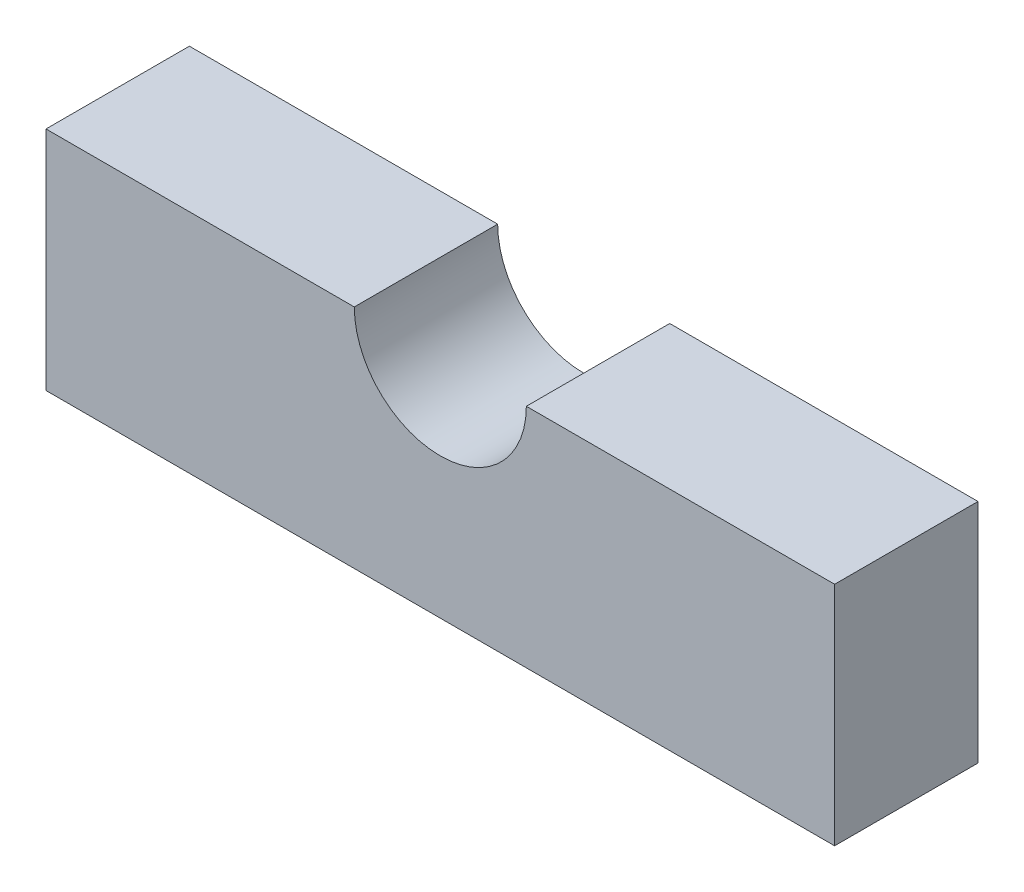
ISO-10303-21;
HEADER;
FILE_DESCRIPTION(('STEP AP214'),'2;1');
FILE_NAME('part.step','',(''),(''),'','','');
FILE_SCHEMA(('AUTOMOTIVE_DESIGN { 1 0 10303 214 1 1 1 1 }'));
ENDSEC;
DATA;
#1=APPLICATION_CONTEXT('core data for automotive mechanical design processes');
#2=APPLICATION_PROTOCOL_DEFINITION('international standard','automotive_design',2000,#1);
#3=PRODUCT_CONTEXT('',#1,'mechanical');
#4=PRODUCT('Part','Part','',(#3));
#5=PRODUCT_RELATED_PRODUCT_CATEGORY('part','',(#4));
#6=PRODUCT_DEFINITION_FORMATION('','',#4);
#7=PRODUCT_DEFINITION_CONTEXT('part definition',#1,'design');
#8=PRODUCT_DEFINITION('design','',#6,#7);
#9=PRODUCT_DEFINITION_SHAPE('','',#8);
#10=(LENGTH_UNIT() NAMED_UNIT(*) SI_UNIT(.MILLI.,.METRE.));
#11=(NAMED_UNIT(*) PLANE_ANGLE_UNIT() SI_UNIT($,.RADIAN.));
#12=(NAMED_UNIT(*) SI_UNIT($,.STERADIAN.) SOLID_ANGLE_UNIT());
#13=UNCERTAINTY_MEASURE_WITH_UNIT(LENGTH_MEASURE(1.E-05),#10,'distance_accuracy_value','');
#14=(GEOMETRIC_REPRESENTATION_CONTEXT(3) GLOBAL_UNCERTAINTY_ASSIGNED_CONTEXT((#13)) GLOBAL_UNIT_ASSIGNED_CONTEXT((#10,
#11,#12)) REPRESENTATION_CONTEXT('',''));
#15=CARTESIAN_POINT('',(0.,0.,0.));
#16=DIRECTION('',(0.,0.,1.));
#17=DIRECTION('',(1.,0.,0.));
#18=AXIS2_PLACEMENT_3D('',#15,#16,#17);
#19=CARTESIAN_POINT('',(34.925,20.066,-6.35000000000001));
#20=DIRECTION('',(0.,0.,1.));
#21=DIRECTION('',(1.,0.,0.));
#22=AXIS2_PLACEMENT_3D('',#19,#20,#21);
#23=PLANE('',#22);
#24=CARTESIAN_POINT('',(0.,20.066,-6.35));
#25=DIRECTION('',(0.,0.,-1.));
#26=DIRECTION('',(-1.,0.,0.));
#27=AXIS2_PLACEMENT_3D('',#24,#25,#26);
#28=CIRCLE('',#27,7.62);
#29=CARTESIAN_POINT('',(7.62000000000001,20.066,-6.35));
#30=VERTEX_POINT('',#29);
#31=CARTESIAN_POINT('',(-7.61999999999999,20.066,-6.35));
#32=VERTEX_POINT('',#31);
#33=EDGE_CURVE('E58',#30,#32,#28,.T.);
#34=ORIENTED_EDGE('',*,*,#33,.F.);
#35=DIRECTION('',(-1.,0.,0.));
#36=VECTOR('',#35,1.);
#37=CARTESIAN_POINT('',(34.925,20.066,-6.35000000000001));
#38=LINE('',#37,#36);
#39=CARTESIAN_POINT('',(34.925,20.066,-6.35000000000001));
#40=VERTEX_POINT('',#39);
#41=EDGE_CURVE('E114',#40,#30,#38,.T.);
#42=ORIENTED_EDGE('',*,*,#41,.F.);
#43=DIRECTION('',(0.,-1.,0.));
#44=VECTOR('',#43,1.);
#45=CARTESIAN_POINT('',(34.925,20.066,-6.35000000000001));
#46=LINE('',#45,#44);
#47=CARTESIAN_POINT('',(34.925,0.,-6.35000000000001));
#48=VERTEX_POINT('',#47);
#49=EDGE_CURVE('E127',#40,#48,#46,.T.);
#50=ORIENTED_EDGE('',*,*,#49,.T.);
#51=DIRECTION('',(-1.,0.,0.));
#52=VECTOR('',#51,1.);
#53=CARTESIAN_POINT('',(34.925,0.,-6.35000000000001));
#54=LINE('',#53,#52);
#55=CARTESIAN_POINT('',(-34.925,0.,-6.35));
#56=VERTEX_POINT('',#55);
#57=EDGE_CURVE('E89',#48,#56,#54,.T.);
#58=ORIENTED_EDGE('',*,*,#57,.T.);
#59=DIRECTION('',(0.,-1.,0.));
#60=VECTOR('',#59,1.);
#61=CARTESIAN_POINT('',(-34.925,20.066,-6.35));
#62=LINE('',#61,#60);
#63=CARTESIAN_POINT('',(-34.925,20.066,-6.35));
#64=VERTEX_POINT('',#63);
#65=EDGE_CURVE('E125',#64,#56,#62,.T.);
#66=ORIENTED_EDGE('',*,*,#65,.F.);
#67=EDGE_CURVE('E66',#32,#64,#38,.T.);
#68=ORIENTED_EDGE('',*,*,#67,.F.);
#69=EDGE_LOOP('',(#34,#42,#50,#58,#66,#68));
#70=FACE_BOUND('',#69,.T.);
#71=ADVANCED_FACE('F44',(#70),#23,.F.);
#72=CARTESIAN_POINT('',(0.,20.066,0.));
#73=DIRECTION('',(0.,1.,0.));
#74=DIRECTION('',(0.,0.,1.));
#75=AXIS2_PLACEMENT_3D('',#72,#73,#74);
#76=PLANE('',#75);
#77=DIRECTION('',(0.,0.,-1.));
#78=VECTOR('',#77,1.);
#79=CARTESIAN_POINT('',(7.62000000000002,20.066,19.05));
#80=LINE('',#79,#78);
#81=CARTESIAN_POINT('',(7.62000000000002,20.066,6.35));
#82=VERTEX_POINT('',#81);
#83=EDGE_CURVE('E11',#82,#30,#80,.T.);
#84=ORIENTED_EDGE('',*,*,#83,.F.);
#85=DIRECTION('',(1.,0.,0.));
#86=VECTOR('',#85,1.);
#87=CARTESIAN_POINT('',(34.925,20.066,6.34999999999999));
#88=LINE('',#87,#86);
#89=CARTESIAN_POINT('',(34.925,20.066,6.34999999999999));
#90=VERTEX_POINT('',#89);
#91=EDGE_CURVE('E154',#82,#90,#88,.T.);
#92=ORIENTED_EDGE('',*,*,#91,.T.);
#93=DIRECTION('',(0.,0.,-1.));
#94=VECTOR('',#93,1.);
#95=CARTESIAN_POINT('',(34.925,20.066,6.34999999999999));
#96=LINE('',#95,#94);
#97=EDGE_CURVE('E117',#90,#40,#96,.T.);
#98=ORIENTED_EDGE('',*,*,#97,.T.);
#99=ORIENTED_EDGE('',*,*,#41,.T.);
#100=EDGE_LOOP('',(#84,#92,#98,#99));
#101=FACE_BOUND('',#100,.T.);
#102=ADVANCED_FACE('F120',(#101),#76,.T.);
#103=CARTESIAN_POINT('',(-34.925,20.066,6.35));
#104=DIRECTION('',(1.,0.,0.));
#105=DIRECTION('',(0.,0.,-1.));
#106=AXIS2_PLACEMENT_3D('',#103,#104,#105);
#107=PLANE('',#106);
#108=DIRECTION('',(0.,0.,1.));
#109=VECTOR('',#108,1.);
#110=CARTESIAN_POINT('',(-34.925,0.,6.35));
#111=LINE('',#110,#109);
#112=CARTESIAN_POINT('',(-34.925,0.,6.35));
#113=VERTEX_POINT('',#112);
#114=EDGE_CURVE('E133',#56,#113,#111,.T.);
#115=ORIENTED_EDGE('',*,*,#114,.T.);
#116=DIRECTION('',(0.,-1.,0.));
#117=VECTOR('',#116,1.);
#118=CARTESIAN_POINT('',(-34.925,20.066,6.35));
#119=LINE('',#118,#117);
#120=CARTESIAN_POINT('',(-34.925,20.066,6.35));
#121=VERTEX_POINT('',#120);
#122=EDGE_CURVE('E147',#121,#113,#119,.T.);
#123=ORIENTED_EDGE('',*,*,#122,.F.);
#124=DIRECTION('',(0.,0.,1.));
#125=VECTOR('',#124,1.);
#126=CARTESIAN_POINT('',(-34.925,20.066,6.35));
#127=LINE('',#126,#125);
#128=EDGE_CURVE('E142',#64,#121,#127,.T.);
#129=ORIENTED_EDGE('',*,*,#128,.F.);
#130=ORIENTED_EDGE('',*,*,#65,.T.);
#131=EDGE_LOOP('',(#115,#123,#129,#130));
#132=FACE_BOUND('',#131,.T.);
#133=ADVANCED_FACE('F50',(#132),#107,.F.);
#134=CARTESIAN_POINT('',(34.925,20.066,6.34999999999999));
#135=DIRECTION('',(0.,0.,-1.));
#136=DIRECTION('',(-1.,0.,0.));
#137=AXIS2_PLACEMENT_3D('',#134,#135,#136);
#138=PLANE('',#137);
#139=ORIENTED_EDGE('',*,*,#91,.F.);
#140=CARTESIAN_POINT('',(0.,20.066,6.35));
#141=DIRECTION('',(0.,0.,-1.));
#142=DIRECTION('',(-1.,0.,0.));
#143=AXIS2_PLACEMENT_3D('',#140,#141,#142);
#144=CIRCLE('',#143,7.62);
#145=CARTESIAN_POINT('',(-7.61999999999998,20.066,6.35));
#146=VERTEX_POINT('',#145);
#147=EDGE_CURVE('E107',#82,#146,#144,.T.);
#148=ORIENTED_EDGE('',*,*,#147,.T.);
#149=EDGE_CURVE('E98',#121,#146,#88,.T.);
#150=ORIENTED_EDGE('',*,*,#149,.F.);
#151=ORIENTED_EDGE('',*,*,#122,.T.);
#152=DIRECTION('',(1.,0.,0.));
#153=VECTOR('',#152,1.);
#154=CARTESIAN_POINT('',(34.925,0.,6.34999999999999));
#155=LINE('',#154,#153);
#156=CARTESIAN_POINT('',(34.925,0.,6.34999999999999));
#157=VERTEX_POINT('',#156);
#158=EDGE_CURVE('E134',#113,#157,#155,.T.);
#159=ORIENTED_EDGE('',*,*,#158,.T.);
#160=DIRECTION('',(0.,-1.,0.));
#161=VECTOR('',#160,1.);
#162=CARTESIAN_POINT('',(34.925,20.066,6.34999999999999));
#163=LINE('',#162,#161);
#164=EDGE_CURVE('E148',#90,#157,#163,.T.);
#165=ORIENTED_EDGE('',*,*,#164,.F.);
#166=EDGE_LOOP('',(#139,#148,#150,#151,#159,#165));
#167=FACE_BOUND('',#166,.T.);
#168=ADVANCED_FACE('F153',(#167),#138,.F.);
#169=CARTESIAN_POINT('',(34.925,20.066,6.34999999999999));
#170=DIRECTION('',(-1.,0.,0.));
#171=DIRECTION('',(0.,0.,1.));
#172=AXIS2_PLACEMENT_3D('',#169,#170,#171);
#173=PLANE('',#172);
#174=DIRECTION('',(0.,0.,-1.));
#175=VECTOR('',#174,1.);
#176=CARTESIAN_POINT('',(34.925,0.,6.34999999999999));
#177=LINE('',#176,#175);
#178=EDGE_CURVE('E136',#157,#48,#177,.T.);
#179=ORIENTED_EDGE('',*,*,#178,.T.);
#180=ORIENTED_EDGE('',*,*,#49,.F.);
#181=ORIENTED_EDGE('',*,*,#97,.F.);
#182=ORIENTED_EDGE('',*,*,#164,.T.);
#183=EDGE_LOOP('',(#179,#180,#181,#182));
#184=FACE_BOUND('',#183,.T.);
#185=ADVANCED_FACE('F205',(#184),#173,.F.);
#186=DIRECTION('',(0.,0.,-1.));
#187=VECTOR('',#186,1.);
#188=CARTESIAN_POINT('',(-7.61999999999998,20.066,19.05));
#189=LINE('',#188,#187);
#190=EDGE_CURVE('E53',#32,#146,#189,.F.);
#191=ORIENTED_EDGE('',*,*,#190,.F.);
#192=ORIENTED_EDGE('',*,*,#67,.T.);
#193=ORIENTED_EDGE('',*,*,#128,.T.);
#194=ORIENTED_EDGE('',*,*,#149,.T.);
#195=EDGE_LOOP('',(#191,#192,#193,#194));
#196=FACE_BOUND('',#195,.T.);
#197=ADVANCED_FACE('F158',(#196),#76,.T.);
#198=CARTESIAN_POINT('',(0.,0.,0.));
#199=DIRECTION('',(0.,1.,0.));
#200=DIRECTION('',(0.,0.,1.));
#201=AXIS2_PLACEMENT_3D('',#198,#199,#200);
#202=PLANE('',#201);
#203=CARTESIAN_POINT('',(-25.4,0.,0.));
#204=DIRECTION('',(0.,-1.,0.));
#205=DIRECTION('',(0.,0.,-1.));
#206=AXIS2_PLACEMENT_3D('',#203,#204,#205);
#207=CIRCLE('',#206,1.27);
#208=CARTESIAN_POINT('',(-25.4,0.,-1.27));
#209=VERTEX_POINT('',#208);
#210=EDGE_CURVE('E174',#209,#209,#207,.T.);
#211=ORIENTED_EDGE('',*,*,#210,.F.);
#212=EDGE_LOOP('',(#211));
#213=FACE_BOUND('',#212,.T.);
#214=CARTESIAN_POINT('',(25.4,0.,0.));
#215=DIRECTION('',(0.,-1.,0.));
#216=DIRECTION('',(0.,0.,-1.));
#217=AXIS2_PLACEMENT_3D('',#214,#215,#216);
#218=CIRCLE('',#217,1.27);
#219=CARTESIAN_POINT('',(25.4,0.,-1.27));
#220=VERTEX_POINT('',#219);
#221=EDGE_CURVE('E173',#220,#220,#218,.T.);
#222=ORIENTED_EDGE('',*,*,#221,.F.);
#223=EDGE_LOOP('',(#222));
#224=FACE_BOUND('',#223,.T.);
#225=ORIENTED_EDGE('',*,*,#114,.F.);
#226=ORIENTED_EDGE('',*,*,#57,.F.);
#227=ORIENTED_EDGE('',*,*,#178,.F.);
#228=ORIENTED_EDGE('',*,*,#158,.F.);
#229=EDGE_LOOP('',(#225,#226,#227,#228));
#230=FACE_BOUND('',#229,.T.);
#231=ADVANCED_FACE('F195',(#213,#224,#230),#202,.F.);
#232=CARTESIAN_POINT('',(0.,20.066,19.05));
#233=DIRECTION('',(0.,0.,-1.));
#234=DIRECTION('',(-1.,0.,0.));
#235=AXIS2_PLACEMENT_3D('',#232,#233,#234);
#236=CYLINDRICAL_SURFACE('',#235,7.62);
#237=ORIENTED_EDGE('',*,*,#83,.T.);
#238=ORIENTED_EDGE('',*,*,#33,.T.);
#239=ORIENTED_EDGE('',*,*,#190,.T.);
#240=ORIENTED_EDGE('',*,*,#147,.F.);
#241=EDGE_LOOP('',(#237,#238,#239,#240));
#242=FACE_BOUND('',#241,.T.);
#243=ADVANCED_FACE('F110',(#242),#236,.F.);
#244=CARTESIAN_POINT('',(25.4,5.08,0.));
#245=DIRECTION('',(0.,-1.,0.));
#246=DIRECTION('',(0.,0.,-1.));
#247=AXIS2_PLACEMENT_3D('',#244,#245,#246);
#248=CYLINDRICAL_SURFACE('',#247,1.27);
#249=CARTESIAN_POINT('',(25.4,5.08,0.));
#250=DIRECTION('',(0.,-1.,0.));
#251=DIRECTION('',(0.,0.,-1.));
#252=AXIS2_PLACEMENT_3D('',#249,#250,#251);
#253=CIRCLE('',#252,1.27);
#254=CARTESIAN_POINT('',(25.4,5.08,-1.27));
#255=VERTEX_POINT('',#254);
#256=EDGE_CURVE('E170',#255,#255,#253,.T.);
#257=ORIENTED_EDGE('',*,*,#256,.F.);
#258=EDGE_LOOP('',(#257));
#259=FACE_BOUND('',#258,.T.);
#260=ORIENTED_EDGE('',*,*,#221,.T.);
#261=EDGE_LOOP('',(#260));
#262=FACE_BOUND('',#261,.T.);
#263=ADVANCED_FACE('F218',(#259,#262),#248,.F.);
#264=CARTESIAN_POINT('',(25.4,5.08,0.));
#265=DIRECTION('',(0.,-1.,0.));
#266=DIRECTION('',(0.,0.,-1.));
#267=AXIS2_PLACEMENT_3D('',#264,#265,#266);
#268=PLANE('',#267);
#269=ORIENTED_EDGE('',*,*,#256,.T.);
#270=EDGE_LOOP('',(#269));
#271=FACE_BOUND('',#270,.T.);
#272=ADVANCED_FACE('F186',(#271),#268,.T.);
#273=CARTESIAN_POINT('',(-25.4,5.08,0.));
#274=DIRECTION('',(0.,-1.,0.));
#275=DIRECTION('',(0.,0.,-1.));
#276=AXIS2_PLACEMENT_3D('',#273,#274,#275);
#277=CYLINDRICAL_SURFACE('',#276,1.27);
#278=CARTESIAN_POINT('',(-25.4,5.08,0.));
#279=DIRECTION('',(0.,-1.,0.));
#280=DIRECTION('',(0.,0.,-1.));
#281=AXIS2_PLACEMENT_3D('',#278,#279,#280);
#282=CIRCLE('',#281,1.27);
#283=CARTESIAN_POINT('',(-25.4,5.08,-1.27));
#284=VERTEX_POINT('',#283);
#285=EDGE_CURVE('E113',#284,#284,#282,.T.);
#286=ORIENTED_EDGE('',*,*,#285,.F.);
#287=EDGE_LOOP('',(#286));
#288=FACE_BOUND('',#287,.T.);
#289=ORIENTED_EDGE('',*,*,#210,.T.);
#290=EDGE_LOOP('',(#289));
#291=FACE_BOUND('',#290,.T.);
#292=ADVANCED_FACE('F183',(#288,#291),#277,.F.);
#293=CARTESIAN_POINT('',(-25.4,5.08,0.));
#294=DIRECTION('',(0.,-1.,0.));
#295=DIRECTION('',(0.,0.,-1.));
#296=AXIS2_PLACEMENT_3D('',#293,#294,#295);
#297=PLANE('',#296);
#298=ORIENTED_EDGE('',*,*,#285,.T.);
#299=EDGE_LOOP('',(#298));
#300=FACE_BOUND('',#299,.T.);
#301=ADVANCED_FACE('F181',(#300),#297,.T.);
#302=CLOSED_SHELL('',(#71,#102,#133,#168,#185,#197,#231,#243,#263,#272,#292,#301));
#303=MANIFOLD_SOLID_BREP('B2',#302);
#304=ADVANCED_BREP_SHAPE_REPRESENTATION('',(#18,#303),#14);
#305=SHAPE_DEFINITION_REPRESENTATION(#9,#304);
ENDSEC;
END-ISO-10303-21;
